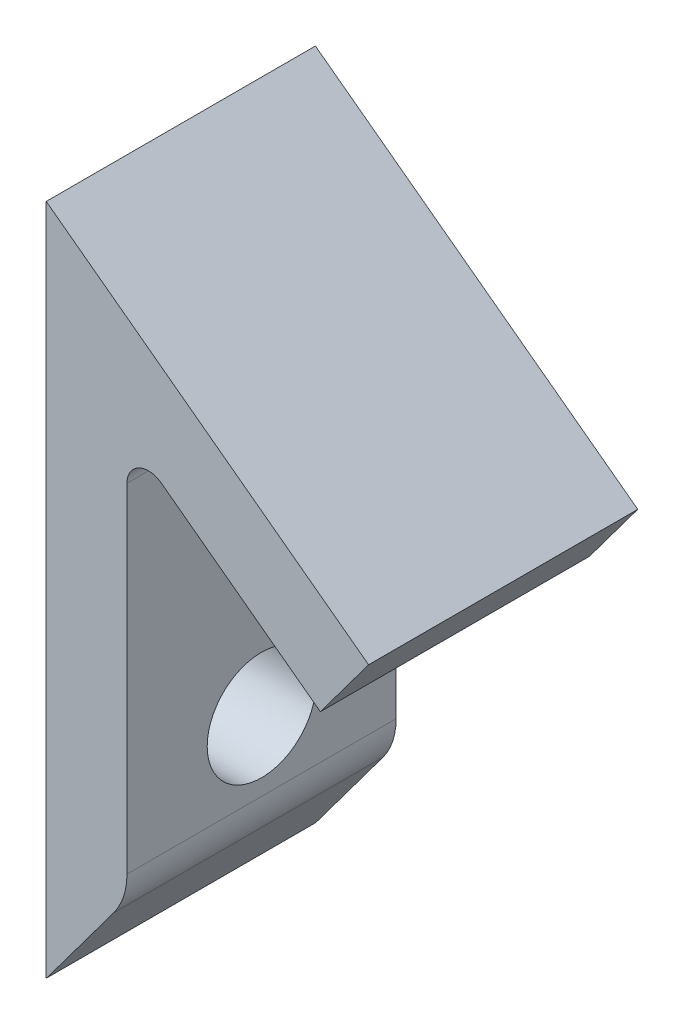
ISO-10303-21;
HEADER;
FILE_DESCRIPTION(('STEP AP214'),'2;1');
FILE_NAME('part.step','',(''),(''),'','','');
FILE_SCHEMA(('AUTOMOTIVE_DESIGN { 1 0 10303 214 1 1 1 1 }'));
ENDSEC;
DATA;
#1=APPLICATION_CONTEXT('core data for automotive mechanical design processes');
#2=APPLICATION_PROTOCOL_DEFINITION('international standard','automotive_design',2000,#1);
#3=PRODUCT_CONTEXT('',#1,'mechanical');
#4=PRODUCT('Part','Part','',(#3));
#5=PRODUCT_RELATED_PRODUCT_CATEGORY('part','',(#4));
#6=PRODUCT_DEFINITION_FORMATION('','',#4);
#7=PRODUCT_DEFINITION_CONTEXT('part definition',#1,'design');
#8=PRODUCT_DEFINITION('design','',#6,#7);
#9=PRODUCT_DEFINITION_SHAPE('','',#8);
#10=(LENGTH_UNIT() NAMED_UNIT(*) SI_UNIT(.MILLI.,.METRE.));
#11=(NAMED_UNIT(*) PLANE_ANGLE_UNIT() SI_UNIT($,.RADIAN.));
#12=(NAMED_UNIT(*) SI_UNIT($,.STERADIAN.) SOLID_ANGLE_UNIT());
#13=UNCERTAINTY_MEASURE_WITH_UNIT(LENGTH_MEASURE(1.E-05),#10,'distance_accuracy_value','');
#14=(GEOMETRIC_REPRESENTATION_CONTEXT(3) GLOBAL_UNCERTAINTY_ASSIGNED_CONTEXT((#13)) GLOBAL_UNIT_ASSIGNED_CONTEXT((#10,
#11,#12)) REPRESENTATION_CONTEXT('',''));
#15=CARTESIAN_POINT('',(0.,0.,0.));
#16=DIRECTION('',(0.,0.,1.));
#17=DIRECTION('',(1.,0.,0.));
#18=AXIS2_PLACEMENT_3D('',#15,#16,#17);
#19=CARTESIAN_POINT('',(0.,0.,10.));
#20=DIRECTION('',(-1.,0.,0.));
#21=DIRECTION('',(0.,0.,1.));
#22=AXIS2_PLACEMENT_3D('',#19,#20,#21);
#23=PLANE('',#22);
#24=CARTESIAN_POINT('',(0.,15.4766226159495,5.));
#25=DIRECTION('',(-1.,0.,0.));
#26=DIRECTION('',(0.,0.,1.));
#27=AXIS2_PLACEMENT_3D('',#24,#25,#26);
#28=CIRCLE('',#27,2.02);
#29=CARTESIAN_POINT('',(0.,15.4766226159495,7.02));
#30=VERTEX_POINT('',#29);
#31=EDGE_CURVE('E132',#30,#30,#28,.T.);
#32=ORIENTED_EDGE('',*,*,#31,.F.);
#33=EDGE_LOOP('',(#32));
#34=FACE_BOUND('',#33,.T.);
#35=CARTESIAN_POINT('',(0.,7.47662261594951,5.00000000000009));
#36=DIRECTION('',(-1.,0.,0.));
#37=DIRECTION('',(0.,0.,1.));
#38=AXIS2_PLACEMENT_3D('',#35,#36,#37);
#39=CIRCLE('',#38,2.02);
#40=CARTESIAN_POINT('',(0.,7.47662261594951,7.02000000000009));
#41=VERTEX_POINT('',#40);
#42=EDGE_CURVE('E215',#41,#41,#39,.T.);
#43=ORIENTED_EDGE('',*,*,#42,.F.);
#44=EDGE_LOOP('',(#43));
#45=FACE_BOUND('',#44,.T.);
#46=DIRECTION('',(0.,1.,0.));
#47=VECTOR('',#46,1.);
#48=CARTESIAN_POINT('',(0.,0.,0.));
#49=LINE('',#48,#47);
#50=CARTESIAN_POINT('',(0.,0.0223832005456538,0.));
#51=VERTEX_POINT('',#50);
#52=CARTESIAN_POINT('',(0.,25.,0.));
#53=VERTEX_POINT('',#52);
#54=EDGE_CURVE('E218',#51,#53,#49,.T.);
#55=ORIENTED_EDGE('',*,*,#54,.F.);
#56=DIRECTION('',(0.,0.,-1.));
#57=VECTOR('',#56,1.);
#58=CARTESIAN_POINT('',(0.,0.0223832005456538,10.));
#59=LINE('',#58,#57);
#60=CARTESIAN_POINT('',(0.,0.0223832005456538,10.));
#61=VERTEX_POINT('',#60);
#62=EDGE_CURVE('E145',#61,#51,#59,.T.);
#63=ORIENTED_EDGE('',*,*,#62,.F.);
#64=DIRECTION('',(0.,1.,0.));
#65=VECTOR('',#64,1.);
#66=CARTESIAN_POINT('',(0.,0.,10.));
#67=LINE('',#66,#65);
#68=CARTESIAN_POINT('',(0.,25.,10.));
#69=VERTEX_POINT('',#68);
#70=EDGE_CURVE('E255',#61,#69,#67,.T.);
#71=ORIENTED_EDGE('',*,*,#70,.T.);
#72=DIRECTION('',(0.,0.,-1.));
#73=VECTOR('',#72,1.);
#74=CARTESIAN_POINT('',(0.,25.,10.));
#75=LINE('',#74,#73);
#76=EDGE_CURVE('E221',#69,#53,#75,.T.);
#77=ORIENTED_EDGE('',*,*,#76,.T.);
#78=EDGE_LOOP('',(#55,#63,#71,#77));
#79=FACE_BOUND('',#78,.T.);
#80=ADVANCED_FACE('F41',(#34,#45,#79),#23,.T.);
#81=CARTESIAN_POINT('',(0.,0.0223832005456538,10.));
#82=DIRECTION('',(0.,1.,0.));
#83=DIRECTION('',(0.,0.,1.));
#84=AXIS2_PLACEMENT_3D('',#81,#82,#83);
#85=PLANE('',#84);
#86=DIRECTION('',(1.,0.,0.));
#87=VECTOR('',#86,1.);
#88=CARTESIAN_POINT('',(0.,0.0223832005456538,0.));
#89=LINE('',#88,#87);
#90=CARTESIAN_POINT('',(0.0166707730138462,0.0223832005456538,0.));
#91=VERTEX_POINT('',#90);
#92=EDGE_CURVE('E226',#51,#91,#89,.T.);
#93=ORIENTED_EDGE('',*,*,#92,.T.);
#94=DIRECTION('',(0.,0.,-1.));
#95=VECTOR('',#94,1.);
#96=CARTESIAN_POINT('',(0.0166707730138462,0.0223832005456538,10.));
#97=LINE('',#96,#95);
#98=CARTESIAN_POINT('',(0.0166707730138462,0.0223832005456538,10.));
#99=VERTEX_POINT('',#98);
#100=EDGE_CURVE('E264',#99,#91,#97,.T.);
#101=ORIENTED_EDGE('',*,*,#100,.F.);
#102=DIRECTION('',(1.,0.,0.));
#103=VECTOR('',#102,1.);
#104=CARTESIAN_POINT('',(0.,0.0223832005456538,10.));
#105=LINE('',#104,#103);
#106=EDGE_CURVE('E270',#61,#99,#105,.T.);
#107=ORIENTED_EDGE('',*,*,#106,.F.);
#108=ORIENTED_EDGE('',*,*,#62,.T.);
#109=EDGE_LOOP('',(#93,#101,#107,#108));
#110=FACE_BOUND('',#109,.T.);
#111=ADVANCED_FACE('F202',(#110),#85,.F.);
#112=CARTESIAN_POINT('',(0.,0.,10.));
#113=DIRECTION('',(0.802001362407354,-0.597322203418513,0.));
#114=DIRECTION('',(0.597322203418513,0.802001362407354,0.));
#115=AXIS2_PLACEMENT_3D('',#112,#113,#114);
#116=PLANE('',#115);
#117=DIRECTION('',(-0.597322203418513,-0.802001362407354,0.));
#118=VECTOR('',#117,1.);
#119=CARTESIAN_POINT('',(0.,0.,0.));
#120=LINE('',#119,#118);
#121=CARTESIAN_POINT('',(2.50500340601839,3.36337094613942,0.));
#122=VERTEX_POINT('',#121);
#123=EDGE_CURVE('E231',#122,#91,#120,.T.);
#124=ORIENTED_EDGE('',*,*,#123,.F.);
#125=DIRECTION('',(0.,0.,-1.));
#126=VECTOR('',#125,1.);
#127=CARTESIAN_POINT('',(2.50500340601839,3.36337094613942,10.));
#128=LINE('',#127,#126);
#129=CARTESIAN_POINT('',(2.50500340601839,3.36337094613942,10.));
#130=VERTEX_POINT('',#129);
#131=EDGE_CURVE('E64',#122,#130,#128,.F.);
#132=ORIENTED_EDGE('',*,*,#131,.T.);
#133=DIRECTION('',(-0.597322203418513,-0.802001362407354,0.));
#134=VECTOR('',#133,1.);
#135=CARTESIAN_POINT('',(0.,0.,10.));
#136=LINE('',#135,#134);
#137=EDGE_CURVE('E272',#130,#99,#136,.T.);
#138=ORIENTED_EDGE('',*,*,#137,.T.);
#139=ORIENTED_EDGE('',*,*,#100,.T.);
#140=EDGE_LOOP('',(#124,#132,#138,#139));
#141=FACE_BOUND('',#140,.T.);
#142=ADVANCED_FACE('F199',(#141),#116,.T.);
#143=CARTESIAN_POINT('',(3.,0.,10.));
#144=DIRECTION('',(1.,0.,0.));
#145=DIRECTION('',(0.,1.,0.));
#146=AXIS2_PLACEMENT_3D('',#143,#144,#145);
#147=PLANE('',#146);
#148=CARTESIAN_POINT('',(3.,15.4766226159495,5.));
#149=DIRECTION('',(1.,0.,0.));
#150=DIRECTION('',(0.,1.,0.));
#151=AXIS2_PLACEMENT_3D('',#148,#149,#150);
#152=CIRCLE('',#151,2.02);
#153=CARTESIAN_POINT('',(3.,17.4316532895023,5.50818802176713));
#154=VERTEX_POINT('',#153);
#155=CARTESIAN_POINT('',(3.,17.4316532895023,4.49181197823287));
#156=VERTEX_POINT('',#155);
#157=EDGE_CURVE('E57',#154,#156,#152,.T.);
#158=ORIENTED_EDGE('',*,*,#157,.F.);
#159=DIRECTION('',(0.,0.,-1.));
#160=VECTOR('',#159,1.);
#161=CARTESIAN_POINT('',(3.,17.4316532895023,10.));
#162=LINE('',#161,#160);
#163=CARTESIAN_POINT('',(3.,17.4316532895023,10.));
#164=VERTEX_POINT('',#163);
#165=EDGE_CURVE('E127',#154,#164,#162,.F.);
#166=ORIENTED_EDGE('',*,*,#165,.T.);
#167=DIRECTION('',(0.,-1.,0.));
#168=VECTOR('',#167,1.);
#169=CARTESIAN_POINT('',(3.,0.,10.));
#170=LINE('',#169,#168);
#171=CARTESIAN_POINT('',(3.,4.85667645468571,10.));
#172=VERTEX_POINT('',#171);
#173=EDGE_CURVE('E275',#164,#172,#170,.T.);
#174=ORIENTED_EDGE('',*,*,#173,.T.);
#175=DIRECTION('',(0.,0.,-1.));
#176=VECTOR('',#175,1.);
#177=CARTESIAN_POINT('',(3.,4.85667645468571,10.));
#178=LINE('',#177,#176);
#179=CARTESIAN_POINT('',(3.,4.85667645468571,0.));
#180=VERTEX_POINT('',#179);
#181=EDGE_CURVE('E153',#172,#180,#178,.T.);
#182=ORIENTED_EDGE('',*,*,#181,.T.);
#183=DIRECTION('',(0.,-1.,0.));
#184=VECTOR('',#183,1.);
#185=CARTESIAN_POINT('',(3.,0.,0.));
#186=LINE('',#185,#184);
#187=CARTESIAN_POINT('',(3.,17.4316532895023,0.));
#188=VERTEX_POINT('',#187);
#189=EDGE_CURVE('E240',#188,#180,#186,.T.);
#190=ORIENTED_EDGE('',*,*,#189,.F.);
#191=EDGE_CURVE('E130',#188,#156,#162,.F.);
#192=ORIENTED_EDGE('',*,*,#191,.T.);
#193=EDGE_LOOP('',(#158,#166,#174,#182,#190,#192));
#194=FACE_BOUND('',#193,.T.);
#195=CARTESIAN_POINT('',(3.,7.47662261594951,5.00000000000009));
#196=DIRECTION('',(1.,0.,0.));
#197=DIRECTION('',(0.,1.,0.));
#198=AXIS2_PLACEMENT_3D('',#195,#196,#197);
#199=CIRCLE('',#198,2.02);
#200=CARTESIAN_POINT('',(3.,9.49662261594951,5.00000000000009));
#201=VERTEX_POINT('',#200);
#202=EDGE_CURVE('E45',#201,#201,#199,.T.);
#203=ORIENTED_EDGE('',*,*,#202,.F.);
#204=EDGE_LOOP('',(#203));
#205=FACE_BOUND('',#204,.T.);
#206=ADVANCED_FACE('F124',(#194,#205),#147,.T.);
#207=CARTESIAN_POINT('',(10.1843639131897,13.6741505453593,10.));
#208=DIRECTION('',(-0.597322203418513,-0.802001362407354,0.));
#209=DIRECTION('',(0.802001362407354,-0.597322203418513,0.));
#210=AXIS2_PLACEMENT_3D('',#207,#208,#209);
#211=PLANE('',#210);
#212=DIRECTION('',(-0.802001362407354,0.597322203418513,0.));
#213=VECTOR('',#212,1.);
#214=CARTESIAN_POINT('',(10.1843639131897,13.6741505453593,10.));
#215=LINE('',#214,#213);
#216=CARTESIAN_POINT('',(10.1843639131897,13.6741505453593,10.));
#217=VERTEX_POINT('',#216);
#218=CARTESIAN_POINT('',(4.27785776273481,18.0732543794282,10.));
#219=VERTEX_POINT('',#218);
#220=EDGE_CURVE('E285',#217,#219,#215,.T.);
#221=ORIENTED_EDGE('',*,*,#220,.T.);
#222=DIRECTION('',(0.,0.,-1.));
#223=VECTOR('',#222,1.);
#224=CARTESIAN_POINT('',(4.27785776273481,18.0732543794282,0.));
#225=LINE('',#224,#223);
#226=CARTESIAN_POINT('',(4.27785776273481,18.0732543794282,0.));
#227=VERTEX_POINT('',#226);
#228=EDGE_CURVE('E139',#219,#227,#225,.T.);
#229=ORIENTED_EDGE('',*,*,#228,.T.);
#230=DIRECTION('',(-0.802001362407354,0.597322203418513,0.));
#231=VECTOR('',#230,1.);
#232=CARTESIAN_POINT('',(10.1843639131897,13.6741505453593,0.));
#233=LINE('',#232,#231);
#234=CARTESIAN_POINT('',(10.1843639131897,13.6741505453593,0.));
#235=VERTEX_POINT('',#234);
#236=EDGE_CURVE('E244',#235,#227,#233,.T.);
#237=ORIENTED_EDGE('',*,*,#236,.F.);
#238=DIRECTION('',(0.,0.,-1.));
#239=VECTOR('',#238,1.);
#240=CARTESIAN_POINT('',(10.1843639131897,13.6741505453593,10.));
#241=LINE('',#240,#239);
#242=EDGE_CURVE('E261',#217,#235,#241,.T.);
#243=ORIENTED_EDGE('',*,*,#242,.F.);
#244=EDGE_LOOP('',(#221,#229,#237,#243));
#245=FACE_BOUND('',#244,.T.);
#246=ADVANCED_FACE('F192',(#245),#211,.T.);
#247=CARTESIAN_POINT('',(0.,0.,10.));
#248=DIRECTION('',(0.802001362407354,-0.597322203418513,0.));
#249=DIRECTION('',(0.597322203418513,0.802001362407354,0.));
#250=AXIS2_PLACEMENT_3D('',#247,#248,#249);
#251=PLANE('',#250);
#252=DIRECTION('',(-0.597322203418513,-0.802001362407354,0.));
#253=VECTOR('',#252,1.);
#254=CARTESIAN_POINT('',(0.,0.,0.));
#255=LINE('',#254,#253);
#256=CARTESIAN_POINT('',(11.9763305234453,16.0801546325813,0.));
#257=VERTEX_POINT('',#256);
#258=EDGE_CURVE('E248',#257,#235,#255,.T.);
#259=ORIENTED_EDGE('',*,*,#258,.F.);
#260=DIRECTION('',(0.,0.,-1.));
#261=VECTOR('',#260,1.);
#262=CARTESIAN_POINT('',(11.9763305234453,16.0801546325813,10.));
#263=LINE('',#262,#261);
#264=CARTESIAN_POINT('',(11.9763305234453,16.0801546325813,10.));
#265=VERTEX_POINT('',#264);
#266=EDGE_CURVE('E258',#265,#257,#263,.T.);
#267=ORIENTED_EDGE('',*,*,#266,.F.);
#268=DIRECTION('',(-0.597322203418513,-0.802001362407354,0.));
#269=VECTOR('',#268,1.);
#270=CARTESIAN_POINT('',(0.,0.,10.));
#271=LINE('',#270,#269);
#272=EDGE_CURVE('E288',#265,#217,#271,.T.);
#273=ORIENTED_EDGE('',*,*,#272,.T.);
#274=ORIENTED_EDGE('',*,*,#242,.T.);
#275=EDGE_LOOP('',(#259,#267,#273,#274));
#276=FACE_BOUND('',#275,.T.);
#277=ADVANCED_FACE('F188',(#276),#251,.T.);
#278=CARTESIAN_POINT('',(11.9763305234453,16.0801546325813,10.));
#279=DIRECTION('',(0.597322203418513,0.802001362407354,0.));
#280=DIRECTION('',(-0.802001362407354,0.597322203418513,0.));
#281=AXIS2_PLACEMENT_3D('',#278,#279,#280);
#282=PLANE('',#281);
#283=DIRECTION('',(0.802001362407354,-0.597322203418513,0.));
#284=VECTOR('',#283,1.);
#285=CARTESIAN_POINT('',(11.9763305234453,16.0801546325813,0.));
#286=LINE('',#285,#284);
#287=EDGE_CURVE('E252',#53,#257,#286,.T.);
#288=ORIENTED_EDGE('',*,*,#287,.F.);
#289=ORIENTED_EDGE('',*,*,#76,.F.);
#290=DIRECTION('',(0.802001362407354,-0.597322203418513,0.));
#291=VECTOR('',#290,1.);
#292=CARTESIAN_POINT('',(11.9763305234453,16.0801546325813,10.));
#293=LINE('',#292,#291);
#294=EDGE_CURVE('E235',#69,#265,#293,.T.);
#295=ORIENTED_EDGE('',*,*,#294,.T.);
#296=ORIENTED_EDGE('',*,*,#266,.T.);
#297=EDGE_LOOP('',(#288,#289,#295,#296));
#298=FACE_BOUND('',#297,.T.);
#299=ADVANCED_FACE('F181',(#298),#282,.T.);
#300=CARTESIAN_POINT('',(0.,0.,10.));
#301=DIRECTION('',(0.,0.,1.));
#302=DIRECTION('',(1.,0.,0.));
#303=AXIS2_PLACEMENT_3D('',#300,#301,#302);
#304=PLANE('',#303);
#305=ORIENTED_EDGE('',*,*,#137,.F.);
#306=CARTESIAN_POINT('',(0.500000000000001,4.85667645468571,10.));
#307=DIRECTION('',(0.,0.,1.));
#308=DIRECTION('',(1.,0.,0.));
#309=AXIS2_PLACEMENT_3D('',#306,#307,#308);
#310=CIRCLE('',#309,2.5);
#311=EDGE_CURVE('E51',#130,#172,#310,.T.);
#312=ORIENTED_EDGE('',*,*,#311,.T.);
#313=ORIENTED_EDGE('',*,*,#173,.F.);
#314=CARTESIAN_POINT('',(3.8,17.4316532895023,10.));
#315=DIRECTION('',(0.,0.,1.));
#316=DIRECTION('',(1.,0.,0.));
#317=AXIS2_PLACEMENT_3D('',#314,#315,#316);
#318=CIRCLE('',#317,0.8);
#319=EDGE_CURVE('E137',#164,#219,#318,.F.);
#320=ORIENTED_EDGE('',*,*,#319,.T.);
#321=ORIENTED_EDGE('',*,*,#220,.F.);
#322=ORIENTED_EDGE('',*,*,#272,.F.);
#323=ORIENTED_EDGE('',*,*,#294,.F.);
#324=ORIENTED_EDGE('',*,*,#70,.F.);
#325=ORIENTED_EDGE('',*,*,#106,.T.);
#326=EDGE_LOOP('',(#305,#312,#313,#320,#321,#322,#323,#324,#325));
#327=FACE_BOUND('',#326,.T.);
#328=ADVANCED_FACE('F177',(#327),#304,.T.);
#329=CARTESIAN_POINT('',(0.,0.,0.));
#330=DIRECTION('',(0.,0.,1.));
#331=DIRECTION('',(1.,0.,0.));
#332=AXIS2_PLACEMENT_3D('',#329,#330,#331);
#333=PLANE('',#332);
#334=ORIENTED_EDGE('',*,*,#189,.T.);
#335=CARTESIAN_POINT('',(0.500000000000001,4.85667645468571,0.));
#336=DIRECTION('',(0.,0.,1.));
#337=DIRECTION('',(1.,0.,0.));
#338=AXIS2_PLACEMENT_3D('',#335,#336,#337);
#339=CIRCLE('',#338,2.5);
#340=EDGE_CURVE('E157',#180,#122,#339,.F.);
#341=ORIENTED_EDGE('',*,*,#340,.T.);
#342=ORIENTED_EDGE('',*,*,#123,.T.);
#343=ORIENTED_EDGE('',*,*,#92,.F.);
#344=ORIENTED_EDGE('',*,*,#54,.T.);
#345=ORIENTED_EDGE('',*,*,#287,.T.);
#346=ORIENTED_EDGE('',*,*,#258,.T.);
#347=ORIENTED_EDGE('',*,*,#236,.T.);
#348=CARTESIAN_POINT('',(3.8,17.4316532895023,0.));
#349=DIRECTION('',(0.,0.,1.));
#350=DIRECTION('',(1.,0.,0.));
#351=AXIS2_PLACEMENT_3D('',#348,#349,#350);
#352=CIRCLE('',#351,0.8);
#353=EDGE_CURVE('E143',#227,#188,#352,.T.);
#354=ORIENTED_EDGE('',*,*,#353,.T.);
#355=EDGE_LOOP('',(#334,#341,#342,#343,#344,#345,#346,#347,#354));
#356=FACE_BOUND('',#355,.T.);
#357=ADVANCED_FACE('F180',(#356),#333,.F.);
#358=CARTESIAN_POINT('',(3.8,17.4316532895023,10.));
#359=DIRECTION('',(0.,0.,1.));
#360=DIRECTION('',(1.,0.,0.));
#361=AXIS2_PLACEMENT_3D('',#358,#359,#360);
#362=CYLINDRICAL_SURFACE('',#361,0.8);
#363=ORIENTED_EDGE('',*,*,#165,.F.);
#364=CARTESIAN_POINT('',(3.,17.4316532895023,5.50818802176713));
#365=CARTESIAN_POINT('',(3.00004473726348,17.4460818453367,5.45270484325696));
#366=CARTESIAN_POINT('',(3.00039216303263,17.458136076932,5.39660720706819));
#367=CARTESIAN_POINT('',(3.00124079676073,17.4774395673678,5.28357253562988));
#368=CARTESIAN_POINT('',(3.00174205657029,17.4846872035115,5.22663522353208));
#369=CARTESIAN_POINT('',(3.00243875780528,17.4942106759419,5.1135443380746));
#370=CARTESIAN_POINT('',(3.00264037852435,17.4965873659106,5.05739929262859));
#371=CARTESIAN_POINT('',(3.00264455106832,17.4966570720317,4.94513364414084));
#372=CARTESIAN_POINT('',(3.0024472827975,17.4943521996294,4.88901304149323));
#373=CARTESIAN_POINT('',(3.00176413887637,17.4849665846268,4.77582509585766));
#374=CARTESIAN_POINT('',(3.00127152623261,17.4777738181449,4.7187668854198));
#375=CARTESIAN_POINT('',(3.00061230598121,17.4633086184154,4.63349898916382));
#376=CARTESIAN_POINT('',(3.00040493383851,17.4578338161984,4.60497381545435));
#377=CARTESIAN_POINT('',(3.00009982643277,17.4456595531061,4.54818520010961));
#378=CARTESIAN_POINT('',(3.00000209216609,17.438960081102,4.51992176085523));
#379=CARTESIAN_POINT('',(3.,17.4316532895023,4.49181197823287));
#380=B_SPLINE_CURVE_WITH_KNOTS('',3,(#364,#365,#366,#367,#368,#369,#370,#371,#372,#373,#374,
#375,#376,#377,#378,#379),.UNSPECIFIED.,.F.,.F.,(4,2,2,2,2,2,2,4),(0.,0.171930324299872,
0.343918662418341,0.512308432352061,0.680622273182832,0.8529298546643,0.940046026168901,
1.02716298935824),.UNSPECIFIED.);
#381=EDGE_CURVE('E11',#154,#156,#380,.T.);
#382=ORIENTED_EDGE('',*,*,#381,.T.);
#383=ORIENTED_EDGE('',*,*,#191,.F.);
#384=ORIENTED_EDGE('',*,*,#353,.F.);
#385=ORIENTED_EDGE('',*,*,#228,.F.);
#386=ORIENTED_EDGE('',*,*,#319,.F.);
#387=EDGE_LOOP('',(#363,#382,#383,#384,#385,#386));
#388=FACE_BOUND('',#387,.T.);
#389=ADVANCED_FACE('F135',(#388),#362,.F.);
#390=CARTESIAN_POINT('',(0.500000000000001,4.85667645468571,10.));
#391=DIRECTION('',(0.,0.,-1.));
#392=DIRECTION('',(-1.,0.,0.));
#393=AXIS2_PLACEMENT_3D('',#390,#391,#392);
#394=CYLINDRICAL_SURFACE('',#393,2.5);
#395=ORIENTED_EDGE('',*,*,#311,.F.);
#396=ORIENTED_EDGE('',*,*,#131,.F.);
#397=ORIENTED_EDGE('',*,*,#340,.F.);
#398=ORIENTED_EDGE('',*,*,#181,.F.);
#399=EDGE_LOOP('',(#395,#396,#397,#398));
#400=FACE_BOUND('',#399,.T.);
#401=ADVANCED_FACE('F43',(#400),#394,.T.);
#402=CARTESIAN_POINT('',(3.99999999999999,15.4766226159495,5.));
#403=DIRECTION('',(-1.,0.,0.));
#404=DIRECTION('',(0.,0.,1.));
#405=AXIS2_PLACEMENT_3D('',#402,#403,#404);
#406=CYLINDRICAL_SURFACE('',#405,2.02);
#407=ORIENTED_EDGE('',*,*,#157,.T.);
#408=ORIENTED_EDGE('',*,*,#381,.F.);
#409=EDGE_LOOP('',(#407,#408));
#410=FACE_BOUND('',#409,.T.);
#411=ORIENTED_EDGE('',*,*,#31,.T.);
#412=EDGE_LOOP('',(#411));
#413=FACE_BOUND('',#412,.T.);
#414=ADVANCED_FACE('F117',(#410,#413),#406,.F.);
#415=CARTESIAN_POINT('',(3.99999999999999,7.47662261594951,5.00000000000009));
#416=DIRECTION('',(-1.,0.,0.));
#417=DIRECTION('',(0.,0.,1.));
#418=AXIS2_PLACEMENT_3D('',#415,#416,#417);
#419=CYLINDRICAL_SURFACE('',#418,2.02);
#420=ORIENTED_EDGE('',*,*,#202,.T.);
#421=EDGE_LOOP('',(#420));
#422=FACE_BOUND('',#421,.T.);
#423=ORIENTED_EDGE('',*,*,#42,.T.);
#424=EDGE_LOOP('',(#423));
#425=FACE_BOUND('',#424,.T.);
#426=ADVANCED_FACE('F173',(#422,#425),#419,.F.);
#427=CLOSED_SHELL('',(#80,#111,#142,#206,#246,#277,#299,#328,#357,#389,#401,#414,#426));
#428=MANIFOLD_SOLID_BREP('B2',#427);
#429=ADVANCED_BREP_SHAPE_REPRESENTATION('',(#18,#428),#14);
#430=SHAPE_DEFINITION_REPRESENTATION(#9,#429);
ENDSEC;
END-ISO-10303-21;
